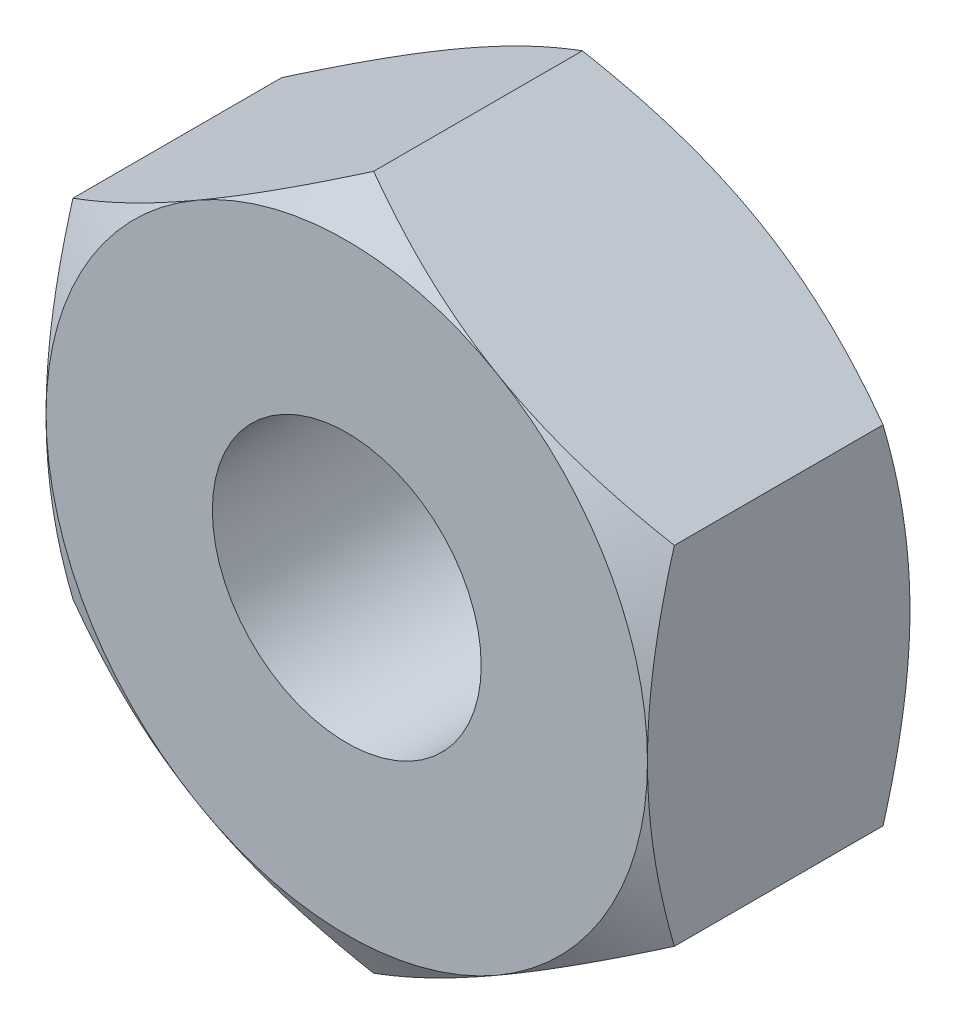
ISO-10303-21;
HEADER;
FILE_DESCRIPTION(('STEP AP214'),'2;1');
FILE_NAME('part.step','',(''),(''),'','','');
FILE_SCHEMA(('AUTOMOTIVE_DESIGN { 1 0 10303 214 1 1 1 1 }'));
ENDSEC;
DATA;
#1=APPLICATION_CONTEXT('core data for automotive mechanical design processes');
#2=APPLICATION_PROTOCOL_DEFINITION('international standard','automotive_design',2000,#1);
#3=PRODUCT_CONTEXT('',#1,'mechanical');
#4=PRODUCT('Part','Part','',(#3));
#5=PRODUCT_RELATED_PRODUCT_CATEGORY('part','',(#4));
#6=PRODUCT_DEFINITION_FORMATION('','',#4);
#7=PRODUCT_DEFINITION_CONTEXT('part definition',#1,'design');
#8=PRODUCT_DEFINITION('design','',#6,#7);
#9=PRODUCT_DEFINITION_SHAPE('','',#8);
#10=(LENGTH_UNIT() NAMED_UNIT(*) SI_UNIT(.MILLI.,.METRE.));
#11=(NAMED_UNIT(*) PLANE_ANGLE_UNIT() SI_UNIT($,.RADIAN.));
#12=(NAMED_UNIT(*) SI_UNIT($,.STERADIAN.) SOLID_ANGLE_UNIT());
#13=UNCERTAINTY_MEASURE_WITH_UNIT(LENGTH_MEASURE(1.E-05),#10,'distance_accuracy_value','');
#14=(GEOMETRIC_REPRESENTATION_CONTEXT(3) GLOBAL_UNCERTAINTY_ASSIGNED_CONTEXT((#13)) GLOBAL_UNIT_ASSIGNED_CONTEXT((#10,
#11,#12)) REPRESENTATION_CONTEXT('',''));
#15=CARTESIAN_POINT('',(0.,0.,0.));
#16=DIRECTION('',(0.,0.,1.));
#17=DIRECTION('',(1.,0.,0.));
#18=AXIS2_PLACEMENT_3D('',#15,#16,#17);
#19=CARTESIAN_POINT('',(2.75000000000003,1.58771324027148,2.4));
#20=DIRECTION('',(-0.499999999999988,-0.866025403784445,0.));
#21=DIRECTION('',(0.866025403784445,-0.499999999999988,0.));
#22=AXIS2_PLACEMENT_3D('',#19,#20,#21);
#23=PLANE('',#22);
#24=CARTESIAN_POINT('',(2.75020000000003,1.58759777021764,2.15431323663522));
#25=CARTESIAN_POINT('',(2.62935077934012,1.65737010029699,2.19461233775072));
#26=CARTESIAN_POINT('',(2.50745839737739,1.72774469983534,2.23126309740233));
#27=CARTESIAN_POINT('',(2.26156287327213,1.86971254687003,2.29523781703019));
#28=CARTESIAN_POINT('',(2.13755536142617,1.94130831721583,2.32253914432549));
#29=CARTESIAN_POINT('',(1.89107720202407,2.08361254889599,2.36503825470588));
#30=CARTESIAN_POINT('',(1.7686444814126,2.15429911309864,2.38051888137754));
#31=CARTESIAN_POINT('',(1.5232028576311,2.29600490065923,2.39900060263006));
#32=CARTESIAN_POINT('',(1.4001948467671,2.36702360884403,2.4020170005374));
#33=CARTESIAN_POINT('',(1.17034121338921,2.49972966594897,2.39574685457146));
#34=CARTESIAN_POINT('',(1.06346120874598,2.56143686540072,2.3879998457233));
#35=CARTESIAN_POINT('',(0.850397532665255,2.68444923614046,2.36344481893565));
#36=CARTESIAN_POINT('',(0.744214598351115,2.74575398185007,2.34662841034944));
#37=CARTESIAN_POINT('',(0.530711510606819,2.86902004703205,2.30458807765405));
#38=CARTESIAN_POINT('',(0.423418383857148,2.93096576264317,2.27918591931278));
#39=CARTESIAN_POINT('',(0.21043252071595,3.05393320806132,2.22153277416003));
#40=CARTESIAN_POINT('',(0.104737054973348,3.11495651365993,2.18929533670103));
#41=CARTESIAN_POINT('',(-0.000200000000000037,3.17554195059676,2.15431323663525));
#42=B_SPLINE_CURVE_WITH_KNOTS('',3,(#24,#25,#26,#27,#28,#29,#30,#31,#32,#33,#34,#35,#36,#37,#38,
#39,#40,#41),.UNSPECIFIED.,.F.,.F.,(4,2,2,2,2,2,2,2,4),(0.,0.435912828725893,0.87287355711634,
1.29901931904673,1.72464171213575,2.09526089052939,2.46622354066376,2.84541551798558,
3.22386274754525),.UNSPECIFIED.);
#43=CARTESIAN_POINT('',(2.75000000000003,1.58771324027148,2.15437990693812));
#44=VERTEX_POINT('',#43);
#45=CARTESIAN_POINT('',(1.37499999999997,2.38156986040723,2.4));
#46=VERTEX_POINT('',#45);
#47=EDGE_CURVE('E63',#44,#46,#42,.T.);
#48=ORIENTED_EDGE('',*,*,#47,.F.);
#49=DIRECTION('',(0.,0.,-1.));
#50=VECTOR('',#49,1.);
#51=CARTESIAN_POINT('',(2.75000000000003,1.58771324027148,2.4));
#52=LINE('',#51,#50);
#53=CARTESIAN_POINT('',(2.75000000000003,1.58771324027148,0.245620093061878));
#54=VERTEX_POINT('',#53);
#55=EDGE_CURVE('E302',#44,#54,#52,.T.);
#56=ORIENTED_EDGE('',*,*,#55,.T.);
#57=CARTESIAN_POINT('',(-0.000199999999999888,3.17554195059676,0.245686763364745));
#58=CARTESIAN_POINT('',(0.120649220659907,3.10576962051741,0.205387662249249));
#59=CARTESIAN_POINT('',(0.242541602622635,3.03539502097906,0.168736902597649));
#60=CARTESIAN_POINT('',(0.488437126727894,2.89342717394437,0.104762182969791));
#61=CARTESIAN_POINT('',(0.612444638573857,2.82183140359857,0.077460855674489));
#62=CARTESIAN_POINT('',(0.858922797975946,2.67952717191842,0.0349617452941111));
#63=CARTESIAN_POINT('',(0.98135551858742,2.60884060771577,0.0194811186224533));
#64=CARTESIAN_POINT('',(1.22679714236892,2.46713482015518,0.000999397369938449));
#65=CARTESIAN_POINT('',(1.34980515323291,2.39611611197038,-0.0020170005374011));
#66=CARTESIAN_POINT('',(1.5796587866108,2.26341005486545,0.00425314542854814));
#67=CARTESIAN_POINT('',(1.68653879125403,2.20170285541369,0.0120001542767051));
#68=CARTESIAN_POINT('',(1.89960246733476,2.07869048467395,0.03655518106436));
#69=CARTESIAN_POINT('',(2.0057854016489,2.01738573896434,0.0533715896505767));
#70=CARTESIAN_POINT('',(2.2192884893932,1.89411967378236,0.0954119223459653));
#71=CARTESIAN_POINT('',(2.32658161614288,1.83217395817124,0.120814080687241));
#72=CARTESIAN_POINT('',(2.53956747928408,1.70920651275308,0.178467225839995));
#73=CARTESIAN_POINT('',(2.64526294502668,1.64818320715447,0.210704663298997));
#74=CARTESIAN_POINT('',(2.75020000000003,1.58759777021764,0.245686763364776));
#75=B_SPLINE_CURVE_WITH_KNOTS('',3,(#57,#58,#59,#60,#61,#62,#63,#64,#65,#66,#67,#68,#69,#70,#71,
#72,#73,#74),.UNSPECIFIED.,.F.,.F.,(4,2,2,2,2,2,2,2,4),(0.,0.435912828725885,0.872873557116326,
1.29901931904671,1.72464171213572,2.09526089052937,2.46622354066374,2.84541551798558,
3.22386274754525),.UNSPECIFIED.);
#76=CARTESIAN_POINT('',(1.37499999999997,2.38156986040723,0.));
#77=VERTEX_POINT('',#76);
#78=EDGE_CURVE('E238',#77,#54,#75,.T.);
#79=ORIENTED_EDGE('',*,*,#78,.F.);
#80=CARTESIAN_POINT('',(0.,3.17542648054292,0.245620093061847));
#81=VERTEX_POINT('',#80);
#82=EDGE_CURVE('E256',#81,#77,#75,.T.);
#83=ORIENTED_EDGE('',*,*,#82,.F.);
#84=DIRECTION('',(0.,0.,-1.));
#85=VECTOR('',#84,1.);
#86=CARTESIAN_POINT('',(0.,3.17542648054292,2.4));
#87=LINE('',#86,#85);
#88=CARTESIAN_POINT('',(0.,3.17542648054292,2.15437990693815));
#89=VERTEX_POINT('',#88);
#90=EDGE_CURVE('E269',#89,#81,#87,.T.);
#91=ORIENTED_EDGE('',*,*,#90,.F.);
#92=EDGE_CURVE('E284',#46,#89,#42,.T.);
#93=ORIENTED_EDGE('',*,*,#92,.F.);
#94=EDGE_LOOP('',(#48,#56,#79,#83,#91,#93));
#95=FACE_BOUND('',#94,.T.);
#96=ADVANCED_FACE('F40',(#95),#23,.F.);
#97=CARTESIAN_POINT('',(0.,3.17542648054292,2.4));
#98=DIRECTION('',(0.499999999999993,-0.866025403784443,0.));
#99=DIRECTION('',(0.866025403784443,0.499999999999993,0.));
#100=AXIS2_PLACEMENT_3D('',#97,#98,#99);
#101=PLANE('',#100);
#102=CARTESIAN_POINT('',(0.000200000000000068,3.17554195059676,2.15431323663525));
#103=CARTESIAN_POINT('',(-0.120649220659906,3.10576962051741,2.19461233775075));
#104=CARTESIAN_POINT('',(-0.242541602622633,3.03539502097906,2.23126309740235));
#105=CARTESIAN_POINT('',(-0.488437126727892,2.89342717394437,2.29523781703021));
#106=CARTESIAN_POINT('',(-0.612444638573855,2.82183140359857,2.32253914432551));
#107=CARTESIAN_POINT('',(-0.858922797975943,2.67952717191841,2.36503825470589));
#108=CARTESIAN_POINT('',(-0.981355518587416,2.60884060771576,2.38051888137755));
#109=CARTESIAN_POINT('',(-1.22679714236891,2.46713482015518,2.39900060263007));
#110=CARTESIAN_POINT('',(-1.34980515323291,2.39611611197037,2.40201700053741));
#111=CARTESIAN_POINT('',(-1.57965878661079,2.26341005486544,2.39574685457146));
#112=CARTESIAN_POINT('',(-1.68653879125402,2.20170285541368,2.3879998457233));
#113=CARTESIAN_POINT('',(-1.89960246733475,2.07869048467395,2.36344481893565));
#114=CARTESIAN_POINT('',(-2.00578540164889,2.01738573896434,2.34662841034943));
#115=CARTESIAN_POINT('',(-2.21928848939318,1.89411967378235,2.30458807765405));
#116=CARTESIAN_POINT('',(-2.32658161614285,1.83217395817123,2.27918591931277));
#117=CARTESIAN_POINT('',(-2.53956747928405,1.70920651275308,2.22153277416002));
#118=CARTESIAN_POINT('',(-2.64526294502665,1.64818320715447,2.18929533670102));
#119=CARTESIAN_POINT('',(-2.7502,1.58759777021764,2.15431323663524));
#120=B_SPLINE_CURVE_WITH_KNOTS('',3,(#102,#103,#104,#105,#106,#107,#108,#109,#110,#111,#112,
#113,#114,#115,#116,#117,#118,#119),.UNSPECIFIED.,.F.,.F.,(4,2,2,2,2,2,2,2,4),(0.,
0.435912828725885,0.872873557116326,1.29901931904671,1.72464171213572,2.09526089052936,
2.46622354066373,2.84541551798555,3.22386274754522),.UNSPECIFIED.);
#121=CARTESIAN_POINT('',(-1.37499999999998,2.38156986040722,2.4));
#122=VERTEX_POINT('',#121);
#123=EDGE_CURVE('E56',#89,#122,#120,.T.);
#124=ORIENTED_EDGE('',*,*,#123,.F.);
#125=ORIENTED_EDGE('',*,*,#90,.T.);
#126=CARTESIAN_POINT('',(-2.7502,1.58759777021764,0.245686763364759));
#127=CARTESIAN_POINT('',(-2.62935077934009,1.657370100297,0.205387662249261));
#128=CARTESIAN_POINT('',(-2.50745839737736,1.72774469983534,0.16873690259766));
#129=CARTESIAN_POINT('',(-2.2615628732721,1.86971254687003,0.104762182969798));
#130=CARTESIAN_POINT('',(-2.13755536142614,1.94130831721583,0.0774608556744943));
#131=CARTESIAN_POINT('',(-1.89107720202405,2.08361254889599,0.0349617452941131));
#132=CARTESIAN_POINT('',(-1.76864448141257,2.15429911309864,0.0194811186224537));
#133=CARTESIAN_POINT('',(-1.52320285763107,2.29600490065923,0.00099939736993548));
#134=CARTESIAN_POINT('',(-1.40019484676708,2.36702360884404,-0.00201700053740572));
#135=CARTESIAN_POINT('',(-1.1703412133892,2.49972966594897,0.00425314542854047));
#136=CARTESIAN_POINT('',(-1.06346120874597,2.56143686540072,0.0120001542766956));
#137=CARTESIAN_POINT('',(-0.850397532665243,2.68444923614046,0.036555181064347));
#138=CARTESIAN_POINT('',(-0.744214598351104,2.74575398185007,0.053371589650562));
#139=CARTESIAN_POINT('',(-0.530711510606811,2.86902004703205,0.0954119223459464));
#140=CARTESIAN_POINT('',(-0.423418383857141,2.93096576264317,0.12081408068722));
#141=CARTESIAN_POINT('',(-0.210432520715947,3.05393320806132,0.178467225839969));
#142=CARTESIAN_POINT('',(-0.104737054973347,3.11495651365993,0.210704663298968));
#143=CARTESIAN_POINT('',(0.000199999999999906,3.17554195059676,0.245686763364745));
#144=B_SPLINE_CURVE_WITH_KNOTS('',3,(#126,#127,#128,#129,#130,#131,#132,#133,#134,#135,#136,
#137,#138,#139,#140,#141,#142,#143),.UNSPECIFIED.,.F.,.F.,(4,2,2,2,2,2,2,2,4),(0.,
0.435912828725888,0.872873557116332,1.29901931904672,1.72464171213574,2.09526089052937,
2.46622354066373,2.84541551798556,3.22386274754522),.UNSPECIFIED.);
#145=CARTESIAN_POINT('',(-1.37499999999998,2.38156986040721,0.));
#146=VERTEX_POINT('',#145);
#147=EDGE_CURVE('E200',#146,#81,#144,.T.);
#148=ORIENTED_EDGE('',*,*,#147,.F.);
#149=CARTESIAN_POINT('',(-2.75,1.58771324027148,0.24562009306186));
#150=VERTEX_POINT('',#149);
#151=EDGE_CURVE('E255',#150,#146,#144,.T.);
#152=ORIENTED_EDGE('',*,*,#151,.F.);
#153=DIRECTION('',(0.,0.,-1.));
#154=VECTOR('',#153,1.);
#155=CARTESIAN_POINT('',(-2.75,1.58771324027148,2.4));
#156=LINE('',#155,#154);
#157=CARTESIAN_POINT('',(-2.75,1.58771324027148,2.15437990693814));
#158=VERTEX_POINT('',#157);
#159=EDGE_CURVE('E293',#158,#150,#156,.T.);
#160=ORIENTED_EDGE('',*,*,#159,.F.);
#161=EDGE_CURVE('E135',#122,#158,#120,.T.);
#162=ORIENTED_EDGE('',*,*,#161,.F.);
#163=EDGE_LOOP('',(#124,#125,#148,#152,#160,#162));
#164=FACE_BOUND('',#163,.T.);
#165=ADVANCED_FACE('F184',(#164),#101,.F.);
#166=CARTESIAN_POINT('',(-2.75,1.58771324027148,2.4));
#167=DIRECTION('',(1.,0.,0.));
#168=DIRECTION('',(0.,1.,0.));
#169=AXIS2_PLACEMENT_3D('',#166,#167,#168);
#170=PLANE('',#169);
#171=CARTESIAN_POINT('',(-2.74999999999997,-4.3374364907856,1.02259068453575));
#172=CARTESIAN_POINT('',(-2.74999999999997,-4.21668297632684,1.08145539212977));
#173=CARTESIAN_POINT('',(-2.74999999999997,-4.09565991534466,1.13977626087958));
#174=CARTESIAN_POINT('',(-2.74999999999997,-3.85293159632068,1.25502579241243));
#175=CARTESIAN_POINT('',(-2.74999999999997,-3.73122624052147,1.31195424908558));
#176=CARTESIAN_POINT('',(-2.74999999999997,-3.48639747629137,1.42438541157054));
#177=CARTESIAN_POINT('',(-2.74999999999997,-3.36326999363584,1.4798792748257));
#178=CARTESIAN_POINT('',(-2.74999999999997,-3.11606063677581,1.5886905941961));
#179=CARTESIAN_POINT('',(-2.74999999999998,-2.99197880595775,1.64200814856341));
#180=CARTESIAN_POINT('',(-2.74999999999998,-2.73841922097274,1.7476631210882));
#181=CARTESIAN_POINT('',(-2.74999999999998,-2.60890159401846,1.79990535269861));
#182=CARTESIAN_POINT('',(-2.74999999999998,-2.34837817612552,1.90060893699885));
#183=CARTESIAN_POINT('',(-2.74999999999998,-2.21737222407672,1.94906987581165));
#184=CARTESIAN_POINT('',(-2.74999999999998,-1.95388620344956,2.04099184384335));
#185=CARTESIAN_POINT('',(-2.74999999999998,-1.82140948770462,2.08446239048313));
#186=CARTESIAN_POINT('',(-2.74999999999998,-1.5545570647704,2.16505703458995));
#187=CARTESIAN_POINT('',(-2.74999999999998,-1.4201819464315,2.20218305516994));
#188=CARTESIAN_POINT('',(-2.74999999999998,-1.15020155114681,2.26815804294274));
#189=CARTESIAN_POINT('',(-2.74999999999998,-1.01460786226709,2.2970535787294));
#190=CARTESIAN_POINT('',(-2.74999999999998,-0.741660873132741,2.34498224284926));
#191=CARTESIAN_POINT('',(-2.74999999999999,-0.604307767672248,2.36401645347349));
#192=CARTESIAN_POINT('',(-2.74999999999999,-0.330350919307992,2.39045867878119));
#193=CARTESIAN_POINT('',(-2.74999999999999,-0.193762526407011,2.39802179576713));
#194=CARTESIAN_POINT('',(-2.74999999999999,0.0795711345654302,2.40129387255956));
#195=CARTESIAN_POINT('',(-2.74999999999999,0.216316404731971,2.39700267216643));
#196=CARTESIAN_POINT('',(-2.74999999999999,0.446339203020201,2.38012375921468));
#197=CARTESIAN_POINT('',(-2.74999999999999,0.53985279127044,2.37054609001925));
#198=CARTESIAN_POINT('',(-2.74999999999999,0.726238383551516,2.34640493595207));
#199=CARTESIAN_POINT('',(-2.74999999999999,0.819110306808893,2.33184083464208));
#200=CARTESIAN_POINT('',(-2.74999999999999,1.0966132972771,2.28143000252485));
#201=CARTESIAN_POINT('',(-2.74999999999999,1.28004120201699,2.23887229474506));
#202=CARTESIAN_POINT('',(-2.75,1.55447412390721,2.16451574499409));
#203=CARTESIAN_POINT('',(-2.75,1.64688532091927,2.13760639076067));
#204=CARTESIAN_POINT('',(-2.75,1.8308113254176,2.0808543830873));
#205=CARTESIAN_POINT('',(-2.75,1.92232612591339,2.05101170679209));
#206=CARTESIAN_POINT('',(-2.75,2.10448679035931,1.98888337289225));
#207=CARTESIAN_POINT('',(-2.75,2.1951328867834,1.95659839067799));
#208=CARTESIAN_POINT('',(-2.75,2.37566387632138,1.88997905538601));
#209=CARTESIAN_POINT('',(-2.75,2.46554878741144,1.85564475086014));
#210=CARTESIAN_POINT('',(-2.75,2.70921665609181,1.75989148700234));
#211=CARTESIAN_POINT('',(-2.75,2.86233959917345,1.69679445551503));
#212=CARTESIAN_POINT('',(-2.75,3.16698958357126,1.56684501802565));
#213=CARTESIAN_POINT('',(-2.75,3.31851643910333,1.49999218046167));
#214=CARTESIAN_POINT('',(-2.75,3.62033953387397,1.36343135891056));
#215=CARTESIAN_POINT('',(-2.75000000000001,3.77063531016818,1.29372235513852));
#216=CARTESIAN_POINT('',(-2.75000000000001,4.07019939608841,1.15212641722021));
#217=CARTESIAN_POINT('',(-2.75000000000001,4.21946767323327,1.08023941460786));
#218=CARTESIAN_POINT('',(-2.75000000000001,4.66651878903756,0.861828955903561));
#219=CARTESIAN_POINT('',(-2.75000000000001,4.96306534802303,0.712778470152965));
#220=CARTESIAN_POINT('',(-2.75000000000001,5.55391082511625,0.410475903586831));
#221=CARTESIAN_POINT('',(-2.75000000000001,5.84821021601236,0.257224739551757));
#222=CARTESIAN_POINT('',(-2.75000000000002,6.40383089196402,-0.0355572881061463));
#223=CARTESIAN_POINT('',(-2.75000000000002,6.66530541427461,-0.17479784648198));
#224=CARTESIAN_POINT('',(-2.75000000000002,7.18737973078273,-0.45494632264209));
#225=CARTESIAN_POINT('',(-2.75000000000002,7.44797946799152,-0.595854346449224));
#226=CARTESIAN_POINT('',(-2.75000000000002,7.96761576117524,-0.878420691377239));
#227=CARTESIAN_POINT('',(-2.75000000000002,8.22665461443523,-1.0200747927889));
#228=CARTESIAN_POINT('',(-2.75000000000003,8.74418626025134,-1.30432785087229));
#229=CARTESIAN_POINT('',(-2.75000000000003,9.00267909538574,-1.44692672999129));
#230=CARTESIAN_POINT('',(-2.75000000000003,9.26098069936511,-1.58986877807102));
#231=B_SPLINE_CURVE_WITH_KNOTS('',3,(#171,#172,#173,#174,#175,#176,#177,#178,#179,#180,#181,
#182,#183,#184,#185,#186,#187,#188,#189,#190,#191,#192,#193,#194,#195,#196,#197,#198,#199,#200,
#201,#202,#203,#204,#205,#206,#207,#208,#209,#210,#211,#212,#213,#214,#215,#216,#217,#218,#219,
#220,#221,#222,#223,#224,#225,#226,#227,#228,#229,#230),.UNSPECIFIED.,.F.,.F.,(4,2,2,2,2,2,2,2,
2,2,2,2,2,2,2,2,2,2,2,2,2,2,2,2,2,2,2,2,2,4),(0.,0.40301598337421,0.806091265961217,
1.21124039369566,1.61637121020937,2.03529641501443,2.45426740866021,2.87242559998334,
3.29045681613043,3.70607354052351,4.12164464086645,4.53154502050441,4.94145093957608,
5.22332396016594,5.50523183936426,6.06931844566414,6.35804005776696,6.6467639196512,
6.93540822825629,7.22404570111203,7.72081118714503,8.2176338713641,8.7146355172951,
9.21165280287365,10.2072810066298,11.2026936221529,12.0913988586536,12.9801609088155,
13.8658805024974,14.7515282704766),.UNSPECIFIED.);
#232=CARTESIAN_POINT('',(-2.75,0.,2.4));
#233=VERTEX_POINT('',#232);
#234=EDGE_CURVE('E129',#158,#233,#231,.F.);
#235=ORIENTED_EDGE('',*,*,#234,.F.);
#236=ORIENTED_EDGE('',*,*,#159,.T.);
#237=CARTESIAN_POINT('',(-2.74999999999997,-4.3374364907856,1.37740931546425));
#238=CARTESIAN_POINT('',(-2.74999999999997,-4.21668297632684,1.31854460787023));
#239=CARTESIAN_POINT('',(-2.74999999999997,-4.09565991534466,1.26022373912042));
#240=CARTESIAN_POINT('',(-2.74999999999997,-3.85293159632068,1.14497420758757));
#241=CARTESIAN_POINT('',(-2.74999999999997,-3.73122624052147,1.08804575091442));
#242=CARTESIAN_POINT('',(-2.74999999999997,-3.48639747629138,0.975614588429458));
#243=CARTESIAN_POINT('',(-2.74999999999997,-3.36326999363584,0.920120725174295));
#244=CARTESIAN_POINT('',(-2.74999999999997,-3.11606063677581,0.811309405803901));
#245=CARTESIAN_POINT('',(-2.74999999999998,-2.99197880595775,0.757991851436588));
#246=CARTESIAN_POINT('',(-2.74999999999998,-2.73841922097274,0.652336878911797));
#247=CARTESIAN_POINT('',(-2.74999999999998,-2.60890159401846,0.600094647301395));
#248=CARTESIAN_POINT('',(-2.74999999999998,-2.34837817612552,0.499391063001153));
#249=CARTESIAN_POINT('',(-2.74999999999998,-2.21737222407672,0.450930124188351));
#250=CARTESIAN_POINT('',(-2.74999999999998,-1.95388620344956,0.359008156156654));
#251=CARTESIAN_POINT('',(-2.74999999999998,-1.82140948770462,0.315537609516873));
#252=CARTESIAN_POINT('',(-2.74999999999998,-1.5545570647704,0.23494296541005));
#253=CARTESIAN_POINT('',(-2.74999999999998,-1.4201819464315,0.197816944830062));
#254=CARTESIAN_POINT('',(-2.74999999999998,-1.15020155114681,0.131841957057262));
#255=CARTESIAN_POINT('',(-2.74999999999998,-1.01460786226709,0.102946421270605));
#256=CARTESIAN_POINT('',(-2.74999999999998,-0.74166087313274,0.0550177571507441));
#257=CARTESIAN_POINT('',(-2.74999999999999,-0.604307767672247,0.0359835465265098));
#258=CARTESIAN_POINT('',(-2.74999999999999,-0.330350919307992,0.00954132121880964));
#259=CARTESIAN_POINT('',(-2.74999999999999,-0.193762526407011,0.00197820423286484));
#260=CARTESIAN_POINT('',(-2.74999999999999,0.0795711345654302,-0.00129387255956411));
#261=CARTESIAN_POINT('',(-2.74999999999999,0.216316404731971,0.00299732783356914));
#262=CARTESIAN_POINT('',(-2.74999999999999,0.446339203020201,0.0198762407853179));
#263=CARTESIAN_POINT('',(-2.74999999999999,0.53985279127044,0.0294539099807471));
#264=CARTESIAN_POINT('',(-2.74999999999999,0.726238383551516,0.0535950640479271));
#265=CARTESIAN_POINT('',(-2.74999999999999,0.819110306808892,0.0681591653579162));
#266=CARTESIAN_POINT('',(-2.74999999999999,1.0966132972771,0.11856999747515));
#267=CARTESIAN_POINT('',(-2.74999999999999,1.28004120201699,0.161127705254941));
#268=CARTESIAN_POINT('',(-2.75,1.55447412390721,0.235484255005912));
#269=CARTESIAN_POINT('',(-2.75,1.64688532091927,0.262393609239333));
#270=CARTESIAN_POINT('',(-2.75,1.8308113254176,0.319145616912697));
#271=CARTESIAN_POINT('',(-2.75,1.92232612591339,0.34898829320791));
#272=CARTESIAN_POINT('',(-2.75,2.10448679035931,0.411116627107751));
#273=CARTESIAN_POINT('',(-2.75,2.1951328867834,0.443401609322013));
#274=CARTESIAN_POINT('',(-2.75,2.37566387632138,0.510020944613989));
#275=CARTESIAN_POINT('',(-2.75,2.46554878741144,0.544355249139862));
#276=CARTESIAN_POINT('',(-2.75,2.70921665609181,0.640108512997655));
#277=CARTESIAN_POINT('',(-2.75,2.86233959917345,0.703205544484967));
#278=CARTESIAN_POINT('',(-2.75,3.16698958357126,0.833154981974348));
#279=CARTESIAN_POINT('',(-2.75,3.31851643910333,0.900007819538325));
#280=CARTESIAN_POINT('',(-2.75,3.62033953387397,1.03656864108944));
#281=CARTESIAN_POINT('',(-2.75000000000001,3.77063531016818,1.10627764486148));
#282=CARTESIAN_POINT('',(-2.75000000000001,4.07019939608841,1.24787358277979));
#283=CARTESIAN_POINT('',(-2.75000000000001,4.21946767323327,1.31976058539214));
#284=CARTESIAN_POINT('',(-2.75000000000001,4.66651878903756,1.53817104409644));
#285=CARTESIAN_POINT('',(-2.75000000000001,4.96306534802303,1.68722152984704));
#286=CARTESIAN_POINT('',(-2.75000000000001,5.55391082511625,1.98952409641317));
#287=CARTESIAN_POINT('',(-2.75000000000001,5.84821021601237,2.14277526044824));
#288=CARTESIAN_POINT('',(-2.75000000000002,6.40383089196402,2.43555728810615));
#289=CARTESIAN_POINT('',(-2.75000000000002,6.66530541427461,2.57479784648198));
#290=CARTESIAN_POINT('',(-2.75000000000002,7.18737973078273,2.85494632264209));
#291=CARTESIAN_POINT('',(-2.75000000000002,7.44797946799153,2.99585434644922));
#292=CARTESIAN_POINT('',(-2.75000000000002,7.96761576117524,3.27842069137724));
#293=CARTESIAN_POINT('',(-2.75000000000002,8.22665461443523,3.4200747927889));
#294=CARTESIAN_POINT('',(-2.75000000000003,8.74418626025134,3.70432785087229));
#295=CARTESIAN_POINT('',(-2.75000000000003,9.00267909538574,3.84692672999129));
#296=CARTESIAN_POINT('',(-2.75000000000003,9.26098069936511,3.98986877807102));
#297=B_SPLINE_CURVE_WITH_KNOTS('',3,(#237,#238,#239,#240,#241,#242,#243,#244,#245,#246,#247,
#248,#249,#250,#251,#252,#253,#254,#255,#256,#257,#258,#259,#260,#261,#262,#263,#264,#265,#266,
#267,#268,#269,#270,#271,#272,#273,#274,#275,#276,#277,#278,#279,#280,#281,#282,#283,#284,#285,
#286,#287,#288,#289,#290,#291,#292,#293,#294,#295,#296),.UNSPECIFIED.,.F.,.F.,(4,2,2,2,2,2,2,2,
2,2,2,2,2,2,2,2,2,2,2,2,2,2,2,2,2,2,2,2,2,4),(0.,0.40301598337421,0.806091265961217,
1.21124039369566,1.61637121020936,2.03529641501443,2.45426740866021,2.87242559998334,
3.29045681613043,3.70607354052351,4.12164464086645,4.53154502050441,4.94145093957608,
5.22332396016594,5.50523183936426,6.06931844566414,6.35804005776696,6.6467639196512,
6.93540822825629,7.22404570111203,7.72081118714503,8.2176338713641,8.7146355172951,
9.21165280287365,10.2072810066298,11.2026936221529,12.0913988586536,12.9801609088155,
13.8658805024974,14.7515282704766),.UNSPECIFIED.);
#298=CARTESIAN_POINT('',(-2.74999999999999,0.,0.));
#299=VERTEX_POINT('',#298);
#300=EDGE_CURVE('E190',#299,#150,#297,.T.);
#301=ORIENTED_EDGE('',*,*,#300,.F.);
#302=CARTESIAN_POINT('',(-2.74999999999998,-1.5877132402715,0.24562009306186));
#303=VERTEX_POINT('',#302);
#304=EDGE_CURVE('E198',#303,#299,#297,.T.);
#305=ORIENTED_EDGE('',*,*,#304,.F.);
#306=DIRECTION('',(0.,0.,-1.));
#307=VECTOR('',#306,1.);
#308=CARTESIAN_POINT('',(-2.74999999999998,-1.5877132402715,2.4));
#309=LINE('',#308,#307);
#310=CARTESIAN_POINT('',(-2.74999999999998,-1.5877132402715,2.15437990693814));
#311=VERTEX_POINT('',#310);
#312=EDGE_CURVE('E157',#311,#303,#309,.T.);
#313=ORIENTED_EDGE('',*,*,#312,.F.);
#314=EDGE_CURVE('E139',#233,#311,#231,.F.);
#315=ORIENTED_EDGE('',*,*,#314,.F.);
#316=EDGE_LOOP('',(#235,#236,#301,#305,#313,#315));
#317=FACE_BOUND('',#316,.T.);
#318=ADVANCED_FACE('F155',(#317),#170,.F.);
#319=CARTESIAN_POINT('',(-2.74999999999998,-1.5877132402715,2.4));
#320=DIRECTION('',(0.499999999999996,0.866025403784441,0.));
#321=DIRECTION('',(-0.866025403784441,0.499999999999996,0.));
#322=AXIS2_PLACEMENT_3D('',#319,#320,#321);
#323=PLANE('',#322);
#324=CARTESIAN_POINT('',(-2.75019999999998,-1.58759777021766,2.15431323663524));
#325=CARTESIAN_POINT('',(-2.62935077934008,-1.65737010029702,2.19461233775074));
#326=CARTESIAN_POINT('',(-2.50745839737735,-1.72774469983536,2.23126309740234));
#327=CARTESIAN_POINT('',(-2.26156287327209,-1.86971254687006,2.2952378170302));
#328=CARTESIAN_POINT('',(-2.13755536142612,-1.94130831721586,2.3225391443255));
#329=CARTESIAN_POINT('',(-1.89107720202404,-2.08361254889602,2.36503825470588));
#330=CARTESIAN_POINT('',(-1.76864448141256,-2.15429911309867,2.38051888137754));
#331=CARTESIAN_POINT('',(-1.52320285763106,-2.29600490065925,2.39900060263006));
#332=CARTESIAN_POINT('',(-1.40019484676707,-2.36702360884406,2.4020170005374));
#333=CARTESIAN_POINT('',(-1.17034121338919,-2.49972966594899,2.39574685457145));
#334=CARTESIAN_POINT('',(-1.06346120874596,-2.56143686540075,2.38799984572329));
#335=CARTESIAN_POINT('',(-0.850397532665233,-2.68444923614048,2.36344481893564));
#336=CARTESIAN_POINT('',(-0.744214598351095,-2.7457539818501,2.34662841034942));
#337=CARTESIAN_POINT('',(-0.530711510606803,-2.86902004703208,2.30458807765404));
#338=CARTESIAN_POINT('',(-0.423418383857133,-2.93096576264319,2.27918591931277));
#339=CARTESIAN_POINT('',(-0.21043252071594,-3.05393320806135,2.22153277416002));
#340=CARTESIAN_POINT('',(-0.104737054973339,-3.11495651365996,2.18929533670102));
#341=CARTESIAN_POINT('',(0.000200000000006767,-3.17554195059679,2.15431323663524));
#342=B_SPLINE_CURVE_WITH_KNOTS('',3,(#324,#325,#326,#327,#328,#329,#330,#331,#332,#333,#334,
#335,#336,#337,#338,#339,#340,#341),.UNSPECIFIED.,.F.,.F.,(4,2,2,2,2,2,2,2,4),(0.,
0.435912828725888,0.872873557116332,1.29901931904671,1.72464171213574,2.09526089052937,
2.46622354066373,2.84541551798555,3.22386274754522),.UNSPECIFIED.);
#343=CARTESIAN_POINT('',(-1.37499999999999,-2.38156986040722,2.4));
#344=VERTEX_POINT('',#343);
#345=EDGE_CURVE('E146',#311,#344,#342,.T.);
#346=ORIENTED_EDGE('',*,*,#345,.F.);
#347=ORIENTED_EDGE('',*,*,#312,.T.);
#348=CARTESIAN_POINT('',(0.000200000000006939,-3.17554195059679,0.245686763364761));
#349=CARTESIAN_POINT('',(-0.1206492206599,-3.10576962051743,0.205387662249264));
#350=CARTESIAN_POINT('',(-0.242541602622628,-3.03539502097909,0.168736902597663));
#351=CARTESIAN_POINT('',(-0.488437126727889,-2.89342717394439,0.104762182969803));
#352=CARTESIAN_POINT('',(-0.612444638573852,-2.82183140359859,0.0774608556744998));
#353=CARTESIAN_POINT('',(-0.858922797975941,-2.67952717191843,0.0349617452941196));
#354=CARTESIAN_POINT('',(-0.981355518587416,-2.60884060771578,0.0194811186224607));
#355=CARTESIAN_POINT('',(-1.22679714236891,-2.4671348201552,0.000999397369943777));
#356=CARTESIAN_POINT('',(-1.34980515323291,-2.39611611197039,-0.00201700053739662));
#357=CARTESIAN_POINT('',(-1.57965878661079,-2.26341005486546,0.0042531454285508));
#358=CARTESIAN_POINT('',(-1.68653879125402,-2.2017028554137,0.0120001542767064));
#359=CARTESIAN_POINT('',(-1.89960246733474,-2.07869048467396,0.0365551810643583));
#360=CARTESIAN_POINT('',(-2.00578540164888,-2.01738573896435,0.0533715896505734));
#361=CARTESIAN_POINT('',(-2.21928848939317,-1.89411967378237,0.0954119223459583));
#362=CARTESIAN_POINT('',(-2.32658161614284,-1.83217395817125,0.120814080687232));
#363=CARTESIAN_POINT('',(-2.53956747928404,-1.7092065127531,0.178467225839981));
#364=CARTESIAN_POINT('',(-2.64526294502664,-1.64818320715449,0.210704663298981));
#365=CARTESIAN_POINT('',(-2.75019999999998,-1.58759777021766,0.245686763364757));
#366=B_SPLINE_CURVE_WITH_KNOTS('',3,(#348,#349,#350,#351,#352,#353,#354,#355,#356,#357,#358,
#359,#360,#361,#362,#363,#364,#365),.UNSPECIFIED.,.F.,.F.,(4,2,2,2,2,2,2,2,4),(0.,
0.435912828725889,0.872873557116334,1.29901931904672,1.72464171213574,2.09526089052937,
2.46622354066373,2.84541551798555,3.22386274754522),.UNSPECIFIED.);
#367=CARTESIAN_POINT('',(-1.37499999999999,-2.38156986040722,0.));
#368=VERTEX_POINT('',#367);
#369=EDGE_CURVE('E199',#368,#303,#366,.T.);
#370=ORIENTED_EDGE('',*,*,#369,.F.);
#371=CARTESIAN_POINT('',(0.,-3.17542648054295,0.245620093061863));
#372=VERTEX_POINT('',#371);
#373=EDGE_CURVE('E243',#372,#368,#366,.T.);
#374=ORIENTED_EDGE('',*,*,#373,.F.);
#375=DIRECTION('',(0.,0.,-1.));
#376=VECTOR('',#375,1.);
#377=CARTESIAN_POINT('',(0.,-3.17542648054295,2.4));
#378=LINE('',#377,#376);
#379=CARTESIAN_POINT('',(0.,-3.17542648054295,2.15437990693814));
#380=VERTEX_POINT('',#379);
#381=EDGE_CURVE('E298',#380,#372,#378,.T.);
#382=ORIENTED_EDGE('',*,*,#381,.F.);
#383=EDGE_CURVE('E158',#344,#380,#342,.T.);
#384=ORIENTED_EDGE('',*,*,#383,.F.);
#385=EDGE_LOOP('',(#346,#347,#370,#374,#382,#384));
#386=FACE_BOUND('',#385,.T.);
#387=ADVANCED_FACE('F183',(#386),#323,.F.);
#388=CARTESIAN_POINT('',(0.,-3.17542648054295,2.4));
#389=DIRECTION('',(-0.499999999999998,0.866025403784439,0.));
#390=DIRECTION('',(-0.86602540378444,-0.499999999999999,0.));
#391=AXIS2_PLACEMENT_3D('',#388,#389,#390);
#392=PLANE('',#391);
#393=CARTESIAN_POINT('',(-0.000199999999993136,-3.17554195059679,2.15431323663524));
#394=CARTESIAN_POINT('',(0.120649220659913,-3.10576962051743,2.19461233775073));
#395=CARTESIAN_POINT('',(0.242541602622641,-3.03539502097909,2.23126309740234));
#396=CARTESIAN_POINT('',(0.488437126727901,-2.89342717394439,2.2952378170302));
#397=CARTESIAN_POINT('',(0.612444638573865,-2.82183140359859,2.3225391443255));
#398=CARTESIAN_POINT('',(0.858922797975954,-2.67952717191843,2.36503825470588));
#399=CARTESIAN_POINT('',(0.981355518587428,-2.60884060771578,2.38051888137754));
#400=CARTESIAN_POINT('',(1.22679714236893,-2.46713482015519,2.39900060263005));
#401=CARTESIAN_POINT('',(1.34980515323292,-2.39611611197038,2.40201700053739));
#402=CARTESIAN_POINT('',(1.57965878661081,-2.26341005486545,2.39574685457145));
#403=CARTESIAN_POINT('',(1.68653879125404,-2.20170285541369,2.38799984572329));
#404=CARTESIAN_POINT('',(1.89960246733477,-2.07869048467395,2.36344481893564));
#405=CARTESIAN_POINT('',(2.00578540164891,-2.01738573896434,2.34662841034942));
#406=CARTESIAN_POINT('',(2.2192884893932,-1.89411967378235,2.30458807765404));
#407=CARTESIAN_POINT('',(2.32658161614287,-1.83217395817123,2.27918591931276));
#408=CARTESIAN_POINT('',(2.53956747928407,-1.70920651275308,2.22153277416001));
#409=CARTESIAN_POINT('',(2.64526294502667,-1.64818320715447,2.18929533670101));
#410=CARTESIAN_POINT('',(2.75020000000002,-1.58759777021764,2.15431323663523));
#411=B_SPLINE_CURVE_WITH_KNOTS('',3,(#393,#394,#395,#396,#397,#398,#399,#400,#401,#402,#403,
#404,#405,#406,#407,#408,#409,#410),.UNSPECIFIED.,.F.,.F.,(4,2,2,2,2,2,2,2,4),(0.,
0.435912828725889,0.872873557116334,1.29901931904672,1.72464171213574,2.09526089052938,
2.46622354066375,2.84541551798558,3.22386274754526),.UNSPECIFIED.);
#412=CARTESIAN_POINT('',(1.375,-2.38156986040721,2.4));
#413=VERTEX_POINT('',#412);
#414=EDGE_CURVE('E418',#380,#413,#411,.T.);
#415=ORIENTED_EDGE('',*,*,#414,.F.);
#416=ORIENTED_EDGE('',*,*,#381,.T.);
#417=CARTESIAN_POINT('',(2.75020000000002,-1.58759777021764,0.245686763364771));
#418=CARTESIAN_POINT('',(2.62935077934012,-1.65737010029699,0.205387662249273));
#419=CARTESIAN_POINT('',(2.50745839737739,-1.72774469983534,0.168736902597671));
#420=CARTESIAN_POINT('',(2.26156287327213,-1.86971254687003,0.104762182969809));
#421=CARTESIAN_POINT('',(2.13755536142616,-1.94130831721583,0.0774608556745048));
#422=CARTESIAN_POINT('',(1.89107720202407,-2.08361254889599,0.0349617452941235));
#423=CARTESIAN_POINT('',(1.7686444814126,-2.15429911309865,0.0194811186224639));
#424=CARTESIAN_POINT('',(1.5232028576311,-2.29600490065923,0.000999397369945761));
#425=CARTESIAN_POINT('',(1.4001948467671,-2.36702360884404,-0.00201700053739532));
#426=CARTESIAN_POINT('',(1.17034121338922,-2.49972966594898,0.00425314542855088));
#427=CARTESIAN_POINT('',(1.06346120874599,-2.56143686540073,0.0120001542767061));
#428=CARTESIAN_POINT('',(0.850397532665261,-2.68444923614047,0.0365551810643578));
#429=CARTESIAN_POINT('',(0.744214598351121,-2.74575398185008,0.0533715896505732));
#430=CARTESIAN_POINT('',(0.530711510606825,-2.86902004703207,0.0954119223459587));
#431=CARTESIAN_POINT('',(0.423418383857154,-2.93096576264319,0.120814080687233));
#432=CARTESIAN_POINT('',(0.210432520715957,-3.05393320806134,0.178467225839983));
#433=CARTESIAN_POINT('',(0.104737054973355,-3.11495651365996,0.210704663298984));
#434=CARTESIAN_POINT('',(-0.000199999999993459,-3.17554195059679,0.245686763364762));
#435=B_SPLINE_CURVE_WITH_KNOTS('',3,(#417,#418,#419,#420,#421,#422,#423,#424,#425,#426,#427,
#428,#429,#430,#431,#432,#433,#434),.UNSPECIFIED.,.F.,.F.,(4,2,2,2,2,2,2,2,4),(0.,
0.435912828725892,0.872873557116338,1.29901931904672,1.72464171213575,2.09526089052939,
2.46622354066376,2.84541551798559,3.22386274754526),.UNSPECIFIED.);
#436=CARTESIAN_POINT('',(1.375,-2.38156986040722,0.));
#437=VERTEX_POINT('',#436);
#438=EDGE_CURVE('E249',#437,#372,#435,.T.);
#439=ORIENTED_EDGE('',*,*,#438,.F.);
#440=CARTESIAN_POINT('',(2.75000000000002,-1.58771324027158,0.245620093061799));
#441=VERTEX_POINT('',#440);
#442=EDGE_CURVE('E231',#441,#437,#435,.T.);
#443=ORIENTED_EDGE('',*,*,#442,.F.);
#444=DIRECTION('',(0.,0.,-1.));
#445=VECTOR('',#444,1.);
#446=CARTESIAN_POINT('',(2.75000000000002,-1.58771324027147,2.4));
#447=LINE('',#446,#445);
#448=CARTESIAN_POINT('',(2.75000000000002,-1.58771324027158,2.1543799069382));
#449=VERTEX_POINT('',#448);
#450=EDGE_CURVE('E300',#449,#441,#447,.T.);
#451=ORIENTED_EDGE('',*,*,#450,.F.);
#452=EDGE_CURVE('E411',#413,#449,#411,.T.);
#453=ORIENTED_EDGE('',*,*,#452,.F.);
#454=EDGE_LOOP('',(#415,#416,#439,#443,#451,#453));
#455=FACE_BOUND('',#454,.T.);
#456=ADVANCED_FACE('F319',(#455),#392,.F.);
#457=CARTESIAN_POINT('',(2.75000000000002,-1.58771324027147,2.4));
#458=DIRECTION('',(-1.,0.,0.));
#459=DIRECTION('',(0.,-1.,0.));
#460=AXIS2_PLACEMENT_3D('',#457,#458,#459);
#461=PLANE('',#460);
#462=CARTESIAN_POINT('',(2.75000000000002,-4.33743649418527,1.02259068287804));
#463=CARTESIAN_POINT('',(2.75000000000002,-4.21668297961201,1.08145539054109));
#464=CARTESIAN_POINT('',(2.75000000000002,-4.09565991851527,1.1397762593599));
#465=CARTESIAN_POINT('',(2.75000000000002,-3.85293159926179,1.25502579103041));
#466=CARTESIAN_POINT('',(2.75000000000002,-3.73122624334766,1.31195424777222));
#467=CARTESIAN_POINT('',(2.75000000000002,-3.48639747888602,1.42438541039454));
#468=CARTESIAN_POINT('',(2.75000000000002,-3.36326999611384,1.47987927371838));
#469=CARTESIAN_POINT('',(2.75000000000002,-3.11606063901975,1.58869059322501));
#470=CARTESIAN_POINT('',(2.75000000000002,-2.99197880808426,1.64200814765988));
#471=CARTESIAN_POINT('',(2.75000000000002,-2.73841922285501,1.7476631203219));
#472=CARTESIAN_POINT('',(2.75000000000002,-2.60890159577384,1.79990535200182));
#473=CARTESIAN_POINT('',(2.75000000000002,-2.34837817762509,1.90060893643743));
#474=CARTESIAN_POINT('',(2.75000000000002,-2.21737222544737,1.94906987531608));
#475=CARTESIAN_POINT('',(2.75000000000002,-1.95388620456,2.04099184347327));
#476=CARTESIAN_POINT('',(2.75000000000002,-1.82140948868377,2.0844623901727));
#477=CARTESIAN_POINT('',(2.75000000000002,-1.55455706548344,2.16505703438924));
#478=CARTESIAN_POINT('',(2.75000000000002,-1.4201819470097,2.2021830550193));
#479=CARTESIAN_POINT('',(2.75000000000002,-1.15020155138705,2.26815804289327));
#480=CARTESIAN_POINT('',(2.75000000000002,-1.01460786230325,2.29705357872727));
#481=CARTESIAN_POINT('',(2.75000000000003,-0.741660872755743,2.34498224291119));
#482=CARTESIAN_POINT('',(2.75000000000003,-0.604307767086161,2.36401645355216));
#483=CARTESIAN_POINT('',(2.75000000000003,-0.330350918307129,2.39045867885598));
#484=CARTESIAN_POINT('',(2.75000000000003,-0.193762525200506,2.39802179582202));
#485=CARTESIAN_POINT('',(2.75000000000003,0.079571136180202,2.40129387253845));
#486=CARTESIAN_POINT('',(2.75000000000003,0.216316406549367,2.39700267208922));
#487=CARTESIAN_POINT('',(2.75000000000003,0.446339205090567,2.38012375902395));
#488=CARTESIAN_POINT('',(2.75000000000003,0.539852793393455,2.37054608978365));
#489=CARTESIAN_POINT('',(2.75000000000003,0.72623838577743,2.34640493562437));
#490=CARTESIAN_POINT('',(2.75000000000003,0.819110309085057,2.33184083426715));
#491=CARTESIAN_POINT('',(2.75000000000003,1.0966132997012,2.28143000200727));
#492=CARTESIAN_POINT('',(2.75000000000003,1.28004120453574,2.23887229413115));
#493=CARTESIAN_POINT('',(2.75000000000003,1.5544741265675,2.16451574423814));
#494=CARTESIAN_POINT('',(2.75000000000003,1.64688532362778,2.13760638995705));
#495=CARTESIAN_POINT('',(2.75000000000003,1.83081132822199,2.08085438218985));
#496=CARTESIAN_POINT('',(2.75000000000003,1.92232612876545,2.05101170584847));
#497=CARTESIAN_POINT('',(2.75000000000003,2.10448679330632,1.98888337185799));
#498=CARTESIAN_POINT('',(2.75000000000003,2.19513288977769,1.95659838959926));
#499=CARTESIAN_POINT('',(2.75000000000003,2.37566387941026,1.88997905421994));
#500=CARTESIAN_POINT('',(2.75000000000003,2.46554879054762,1.85564474965119));
#501=CARTESIAN_POINT('',(2.75000000000003,2.70921665925416,1.75989148571907));
#502=CARTESIAN_POINT('',(2.75000000000003,2.86233960231613,1.69679445420511));
#503=CARTESIAN_POINT('',(2.75000000000003,3.16698958667717,1.56684501667026));
#504=CARTESIAN_POINT('',(2.75000000000003,3.31851644219212,1.49999217908746));
#505=CARTESIAN_POINT('',(2.75000000000003,3.62033953693038,1.36343135750433));
#506=CARTESIAN_POINT('',(2.75000000000004,3.77063531320934,1.2937223537191));
#507=CARTESIAN_POINT('',(2.75000000000004,4.07019939910066,1.15212641577841));
#508=CARTESIAN_POINT('',(2.75000000000004,4.21946767623188,1.08023941315687));
#509=CARTESIAN_POINT('',(2.75000000000004,4.66651879199539,0.861828954430084));
#510=CARTESIAN_POINT('',(2.75000000000004,4.96306535095561,0.71277846867054));
#511=CARTESIAN_POINT('',(2.75000000000004,5.55391082800165,0.410475902092685));
#512=CARTESIAN_POINT('',(2.75000000000004,5.84821021887582,0.257224738054833));
#513=CARTESIAN_POINT('',(2.75000000000004,6.40383089480581,-0.0355572896142779));
#514=CARTESIAN_POINT('',(2.75000000000004,6.66530541711642,-0.174797847999083));
#515=CARTESIAN_POINT('',(2.75000000000004,7.1873797336254,-0.454946324175309));
#516=CARTESIAN_POINT('',(2.75000000000004,7.44797947083505,-0.595854347989587));
#517=CARTESIAN_POINT('',(2.75000000000004,7.96761576402423,-0.878420692932346));
#518=CARTESIAN_POINT('',(2.75000000000004,8.2266546172888,-1.02007479435162));
#519=CARTESIAN_POINT('',(2.75000000000005,8.74418626311464,-1.30432785244943));
#520=CARTESIAN_POINT('',(2.75000000000005,9.00267909825416,-1.44692673157524));
#521=CARTESIAN_POINT('',(2.75000000000005,9.26098070223879,-1.5898687796615));
#522=B_SPLINE_CURVE_WITH_KNOTS('',3,(#462,#463,#464,#465,#466,#467,#468,#469,#470,#471,#472,
#473,#474,#475,#476,#477,#478,#479,#480,#481,#482,#483,#484,#485,#486,#487,#488,#489,#490,#491,
#492,#493,#494,#495,#496,#497,#498,#499,#500,#501,#502,#503,#504,#505,#506,#507,#508,#509,#510,
#511,#512,#513,#514,#515,#516,#517,#518,#519,#520,#521),.UNSPECIFIED.,.F.,.F.,(4,2,2,2,2,2,2,2,
2,2,2,2,2,2,2,2,2,2,2,2,2,2,2,2,2,2,2,2,2,4),(0.,0.403015983773714,0.806091266760281,
1.21124039489841,1.61637121181576,2.03529641705186,2.45426741112882,2.87242560288175,
3.29045681945831,3.70607354447844,4.12164464544751,4.53154502569577,4.94145094537801,
5.22332396613868,5.50523184550783,6.0693184521501,6.35804006443189,6.64676392649507,
6.93540823527862,7.22404570831284,7.72081119432205,8.21763387851709,8.71463552442328,
9.21165280997696,10.2072810136777,11.2026936291463,12.0913988656597,12.9801609158341,
13.865880509539,14.7515282775415),.UNSPECIFIED.);
#523=CARTESIAN_POINT('',(2.75000000000003,0.,2.4));
#524=VERTEX_POINT('',#523);
#525=EDGE_CURVE('E413',#449,#524,#522,.T.);
#526=ORIENTED_EDGE('',*,*,#525,.F.);
#527=ORIENTED_EDGE('',*,*,#450,.T.);
#528=CARTESIAN_POINT('',(2.75000000000002,-4.33743649418527,1.37740931712196));
#529=CARTESIAN_POINT('',(2.75000000000002,-4.21668297961201,1.31854460945891));
#530=CARTESIAN_POINT('',(2.75000000000002,-4.09565991851527,1.2602237406401));
#531=CARTESIAN_POINT('',(2.75000000000002,-3.85293159926179,1.14497420896959));
#532=CARTESIAN_POINT('',(2.75000000000002,-3.73122624334766,1.08804575222778));
#533=CARTESIAN_POINT('',(2.75000000000002,-3.48639747888602,0.975614589605464));
#534=CARTESIAN_POINT('',(2.75000000000002,-3.36326999611384,0.920120726281621));
#535=CARTESIAN_POINT('',(2.75000000000002,-3.11606063901975,0.811309406774991));
#536=CARTESIAN_POINT('',(2.75000000000002,-2.99197880808426,0.757991852340124));
#537=CARTESIAN_POINT('',(2.75000000000002,-2.73841922285501,0.652336879678101));
#538=CARTESIAN_POINT('',(2.75000000000002,-2.60890159577384,0.600094647998181));
#539=CARTESIAN_POINT('',(2.75000000000002,-2.34837817762509,0.499391063562571));
#540=CARTESIAN_POINT('',(2.75000000000002,-2.21737222544737,0.450930124683919));
#541=CARTESIAN_POINT('',(2.75000000000002,-1.95388620456,0.359008156526732));
#542=CARTESIAN_POINT('',(2.75000000000002,-1.82140948868377,0.315537609827295));
#543=CARTESIAN_POINT('',(2.75000000000002,-1.55455706548344,0.234942965610757));
#544=CARTESIAN_POINT('',(2.75000000000002,-1.4201819470097,0.197816944980705));
#545=CARTESIAN_POINT('',(2.75000000000002,-1.15020155138705,0.13184195710673));
#546=CARTESIAN_POINT('',(2.75000000000002,-1.01460786230325,0.102946421272726));
#547=CARTESIAN_POINT('',(2.75000000000003,-0.741660872755743,0.0550177570888093));
#548=CARTESIAN_POINT('',(2.75000000000003,-0.604307767086162,0.0359835464478425));
#549=CARTESIAN_POINT('',(2.75000000000003,-0.33035091830713,0.00954132114401951));
#550=CARTESIAN_POINT('',(2.75000000000003,-0.193762525200506,0.00197820417798272));
#551=CARTESIAN_POINT('',(2.75000000000003,0.0795711361802021,-0.00129387253844921));
#552=CARTESIAN_POINT('',(2.75000000000003,0.216316406549367,0.00299732791078131));
#553=CARTESIAN_POINT('',(2.75000000000003,0.446339205090567,0.0198762409760531));
#554=CARTESIAN_POINT('',(2.75000000000003,0.539852793393455,0.0294539102163504));
#555=CARTESIAN_POINT('',(2.75000000000003,0.72623838577743,0.0535950643756287));
#556=CARTESIAN_POINT('',(2.75000000000003,0.819110309085056,0.0681591657328484));
#557=CARTESIAN_POINT('',(2.75000000000003,1.0966132997012,0.118569997992735));
#558=CARTESIAN_POINT('',(2.75000000000003,1.28004120453574,0.161127705868848));
#559=CARTESIAN_POINT('',(2.75000000000003,1.5544741265675,0.235484255761859));
#560=CARTESIAN_POINT('',(2.75000000000003,1.64688532362778,0.262393610042949));
#561=CARTESIAN_POINT('',(2.75000000000003,1.83081132822199,0.319145617810152));
#562=CARTESIAN_POINT('',(2.75000000000003,1.92232612876545,0.348988294151533));
#563=CARTESIAN_POINT('',(2.75000000000003,2.10448679330632,0.411116628142013));
#564=CARTESIAN_POINT('',(2.75000000000003,2.19513288977769,0.443401610400742));
#565=CARTESIAN_POINT('',(2.75000000000003,2.37566387941026,0.51002094578006));
#566=CARTESIAN_POINT('',(2.75000000000003,2.46554879054762,0.54435525034881));
#567=CARTESIAN_POINT('',(2.75000000000003,2.70921665925416,0.640108514280933));
#568=CARTESIAN_POINT('',(2.75000000000003,2.86233960231613,0.703205545794888));
#569=CARTESIAN_POINT('',(2.75000000000003,3.16698958667717,0.833154983329739));
#570=CARTESIAN_POINT('',(2.75000000000003,3.31851644219212,0.900007820912542));
#571=CARTESIAN_POINT('',(2.75000000000003,3.62033953693038,1.03656864249567));
#572=CARTESIAN_POINT('',(2.75000000000004,3.77063531320933,1.1062776462809));
#573=CARTESIAN_POINT('',(2.75000000000004,4.07019939910066,1.24787358422159));
#574=CARTESIAN_POINT('',(2.75000000000004,4.21946767623188,1.31976058684313));
#575=CARTESIAN_POINT('',(2.75000000000004,4.66651879199539,1.53817104556991));
#576=CARTESIAN_POINT('',(2.75000000000004,4.96306535095561,1.68722153132946));
#577=CARTESIAN_POINT('',(2.75000000000004,5.55391082800165,1.98952409790731));
#578=CARTESIAN_POINT('',(2.75000000000004,5.84821021887582,2.14277526194516));
#579=CARTESIAN_POINT('',(2.75000000000004,6.40383089480581,2.43555728961428));
#580=CARTESIAN_POINT('',(2.75000000000004,6.66530541711641,2.57479784799908));
#581=CARTESIAN_POINT('',(2.75000000000004,7.1873797336254,2.85494632417531));
#582=CARTESIAN_POINT('',(2.75000000000004,7.44797947083505,2.99585434798959));
#583=CARTESIAN_POINT('',(2.75000000000004,7.96761576402423,3.27842069293235));
#584=CARTESIAN_POINT('',(2.75000000000004,8.2266546172888,3.42007479435162));
#585=CARTESIAN_POINT('',(2.75000000000005,8.74418626311464,3.70432785244943));
#586=CARTESIAN_POINT('',(2.75000000000005,9.00267909825416,3.84692673157524));
#587=CARTESIAN_POINT('',(2.75000000000005,9.26098070223879,3.9898687796615));
#588=B_SPLINE_CURVE_WITH_KNOTS('',3,(#528,#529,#530,#531,#532,#533,#534,#535,#536,#537,#538,
#539,#540,#541,#542,#543,#544,#545,#546,#547,#548,#549,#550,#551,#552,#553,#554,#555,#556,#557,
#558,#559,#560,#561,#562,#563,#564,#565,#566,#567,#568,#569,#570,#571,#572,#573,#574,#575,#576,
#577,#578,#579,#580,#581,#582,#583,#584,#585,#586,#587),.UNSPECIFIED.,.F.,.F.,(4,2,2,2,2,2,2,2,
2,2,2,2,2,2,2,2,2,2,2,2,2,2,2,2,2,2,2,2,2,4),(0.,0.403015983773714,0.806091266760281,
1.21124039489841,1.61637121181576,2.03529641705186,2.45426741112882,2.87242560288175,
3.2904568194583,3.70607354447843,4.12164464544751,4.53154502569577,4.94145094537801,
5.22332396613868,5.50523184550783,6.06931845215011,6.35804006443189,6.64676392649507,
6.93540823527862,7.22404570831285,7.72081119432205,8.21763387851709,8.71463552442328,
9.21165280997696,10.2072810136777,11.2026936291463,12.0913988656597,12.9801609158341,
13.865880509539,14.7515282775415),.UNSPECIFIED.);
#589=CARTESIAN_POINT('',(2.75000000000003,0.,0.));
#590=VERTEX_POINT('',#589);
#591=EDGE_CURVE('E222',#590,#441,#588,.F.);
#592=ORIENTED_EDGE('',*,*,#591,.F.);
#593=EDGE_CURVE('E151',#54,#590,#588,.F.);
#594=ORIENTED_EDGE('',*,*,#593,.F.);
#595=ORIENTED_EDGE('',*,*,#55,.F.);
#596=EDGE_CURVE('E421',#524,#44,#522,.T.);
#597=ORIENTED_EDGE('',*,*,#596,.F.);
#598=EDGE_LOOP('',(#526,#527,#592,#594,#595,#597));
#599=FACE_BOUND('',#598,.T.);
#600=ADVANCED_FACE('F313',(#599),#461,.F.);
#601=CARTESIAN_POINT('',(2.75000000000003,1.58771324027148,2.4));
#602=DIRECTION('',(0.,0.,-1.));
#603=DIRECTION('',(-1.,0.,0.));
#604=AXIS2_PLACEMENT_3D('',#601,#602,#603);
#605=PLANE('',#604);
#606=CARTESIAN_POINT('',(0.,0.,2.4));
#607=DIRECTION('',(0.,0.,1.));
#608=DIRECTION('',(1.,0.,0.));
#609=AXIS2_PLACEMENT_3D('',#606,#607,#608);
#610=CIRCLE('',#609,1.229375);
#611=CARTESIAN_POINT('',(1.229375,0.,2.4));
#612=VERTEX_POINT('',#611);
#613=EDGE_CURVE('E206',#612,#612,#610,.T.);
#614=ORIENTED_EDGE('',*,*,#613,.F.);
#615=EDGE_LOOP('',(#614));
#616=FACE_BOUND('',#615,.T.);
#617=CARTESIAN_POINT('',(0.,0.,2.4));
#618=DIRECTION('',(0.,0.,-1.));
#619=DIRECTION('',(-1.,0.,0.));
#620=AXIS2_PLACEMENT_3D('',#617,#618,#619);
#621=CIRCLE('',#620,2.75);
#622=EDGE_CURVE('E12',#233,#122,#621,.T.);
#623=ORIENTED_EDGE('',*,*,#622,.F.);
#624=EDGE_CURVE('E44',#344,#233,#621,.T.);
#625=ORIENTED_EDGE('',*,*,#624,.F.);
#626=EDGE_CURVE('E150',#413,#344,#621,.T.);
#627=ORIENTED_EDGE('',*,*,#626,.F.);
#628=EDGE_CURVE('E415',#524,#413,#621,.T.);
#629=ORIENTED_EDGE('',*,*,#628,.F.);
#630=CARTESIAN_POINT('',(0.,0.,2.4));
#631=DIRECTION('',(0.,0.,1.));
#632=DIRECTION('',(1.,0.,0.));
#633=AXIS2_PLACEMENT_3D('',#630,#631,#632);
#634=CIRCLE('',#633,2.75);
#635=EDGE_CURVE('E514',#524,#46,#634,.T.);
#636=ORIENTED_EDGE('',*,*,#635,.T.);
#637=EDGE_CURVE('E49',#122,#46,#621,.T.);
#638=ORIENTED_EDGE('',*,*,#637,.F.);
#639=EDGE_LOOP('',(#623,#625,#627,#629,#636,#638));
#640=FACE_BOUND('',#639,.T.);
#641=ADVANCED_FACE('F152',(#616,#640),#605,.F.);
#642=CARTESIAN_POINT('',(2.75000000000003,1.58771324027148,0.));
#643=DIRECTION('',(0.,0.,-1.));
#644=DIRECTION('',(-1.,0.,0.));
#645=AXIS2_PLACEMENT_3D('',#642,#643,#644);
#646=PLANE('',#645);
#647=CARTESIAN_POINT('',(0.,0.,0.));
#648=DIRECTION('',(0.,0.,1.));
#649=DIRECTION('',(1.,0.,0.));
#650=AXIS2_PLACEMENT_3D('',#647,#648,#649);
#651=CIRCLE('',#650,1.229375);
#652=CARTESIAN_POINT('',(1.229375,0.,0.));
#653=VERTEX_POINT('',#652);
#654=EDGE_CURVE('E303',#653,#653,#651,.T.);
#655=ORIENTED_EDGE('',*,*,#654,.T.);
#656=EDGE_LOOP('',(#655));
#657=FACE_BOUND('',#656,.T.);
#658=CARTESIAN_POINT('',(0.,0.,0.));
#659=DIRECTION('',(0.,0.,-1.));
#660=DIRECTION('',(-1.,0.,0.));
#661=AXIS2_PLACEMENT_3D('',#658,#659,#660);
#662=CIRCLE('',#661,2.75);
#663=EDGE_CURVE('E279',#368,#299,#662,.T.);
#664=ORIENTED_EDGE('',*,*,#663,.T.);
#665=EDGE_CURVE('E265',#299,#146,#662,.T.);
#666=ORIENTED_EDGE('',*,*,#665,.T.);
#667=EDGE_CURVE('E277',#146,#77,#662,.T.);
#668=ORIENTED_EDGE('',*,*,#667,.T.);
#669=EDGE_CURVE('E281',#77,#590,#662,.T.);
#670=ORIENTED_EDGE('',*,*,#669,.T.);
#671=EDGE_CURVE('E283',#590,#437,#662,.T.);
#672=ORIENTED_EDGE('',*,*,#671,.T.);
#673=EDGE_CURVE('E282',#437,#368,#662,.T.);
#674=ORIENTED_EDGE('',*,*,#673,.T.);
#675=EDGE_LOOP('',(#664,#666,#668,#670,#672,#674));
#676=FACE_BOUND('',#675,.T.);
#677=ADVANCED_FACE('F275',(#657,#676),#646,.T.);
#678=CARTESIAN_POINT('',(0.,0.,2.4));
#679=DIRECTION('',(0.,0.,-1.));
#680=DIRECTION('',(-1.,0.,0.));
#681=AXIS2_PLACEMENT_3D('',#678,#679,#680);
#682=CYLINDRICAL_SURFACE('',#681,1.229375);
#683=ORIENTED_EDGE('',*,*,#613,.T.);
#684=EDGE_LOOP('',(#683));
#685=FACE_BOUND('',#684,.T.);
#686=ORIENTED_EDGE('',*,*,#654,.F.);
#687=EDGE_LOOP('',(#686));
#688=FACE_BOUND('',#687,.T.);
#689=ADVANCED_FACE('F216',(#685,#688),#682,.F.);
#690=CARTESIAN_POINT('',(0.,0.,0.));
#691=DIRECTION('',(0.,0.,1.));
#692=DIRECTION('',(-1.,0.,0.));
#693=AXIS2_PLACEMENT_3D('',#690,#691,#692);
#694=CONICAL_SURFACE('',#693,2.75,1.0471975511966);
#695=ORIENTED_EDGE('',*,*,#442,.T.);
#696=ORIENTED_EDGE('',*,*,#671,.F.);
#697=ORIENTED_EDGE('',*,*,#591,.T.);
#698=EDGE_LOOP('',(#695,#696,#697));
#699=FACE_BOUND('',#698,.T.);
#700=ADVANCED_FACE('F215',(#699),#694,.T.);
#701=ORIENTED_EDGE('',*,*,#78,.T.);
#702=ORIENTED_EDGE('',*,*,#593,.T.);
#703=ORIENTED_EDGE('',*,*,#669,.F.);
#704=EDGE_LOOP('',(#701,#702,#703));
#705=FACE_BOUND('',#704,.T.);
#706=ADVANCED_FACE('F431',(#705),#694,.T.);
#707=ORIENTED_EDGE('',*,*,#373,.T.);
#708=ORIENTED_EDGE('',*,*,#673,.F.);
#709=ORIENTED_EDGE('',*,*,#438,.T.);
#710=EDGE_LOOP('',(#707,#708,#709));
#711=FACE_BOUND('',#710,.T.);
#712=ADVANCED_FACE('F213',(#711),#694,.T.);
#713=ORIENTED_EDGE('',*,*,#304,.T.);
#714=ORIENTED_EDGE('',*,*,#663,.F.);
#715=ORIENTED_EDGE('',*,*,#369,.T.);
#716=EDGE_LOOP('',(#713,#714,#715));
#717=FACE_BOUND('',#716,.T.);
#718=ADVANCED_FACE('F208',(#717),#694,.T.);
#719=ORIENTED_EDGE('',*,*,#300,.T.);
#720=ORIENTED_EDGE('',*,*,#151,.T.);
#721=ORIENTED_EDGE('',*,*,#665,.F.);
#722=EDGE_LOOP('',(#719,#720,#721));
#723=FACE_BOUND('',#722,.T.);
#724=ADVANCED_FACE('F212',(#723),#694,.T.);
#725=ORIENTED_EDGE('',*,*,#147,.T.);
#726=ORIENTED_EDGE('',*,*,#82,.T.);
#727=ORIENTED_EDGE('',*,*,#667,.F.);
#728=EDGE_LOOP('',(#725,#726,#727));
#729=FACE_BOUND('',#728,.T.);
#730=ADVANCED_FACE('F365',(#729),#694,.T.);
#731=CARTESIAN_POINT('',(0.,0.,2.4));
#732=DIRECTION('',(0.,0.,-1.));
#733=DIRECTION('',(1.,0.,0.));
#734=AXIS2_PLACEMENT_3D('',#731,#732,#733);
#735=CONICAL_SURFACE('',#734,2.75,1.0471975511966);
#736=ORIENTED_EDGE('',*,*,#314,.T.);
#737=ORIENTED_EDGE('',*,*,#345,.T.);
#738=ORIENTED_EDGE('',*,*,#624,.T.);
#739=EDGE_LOOP('',(#736,#737,#738));
#740=FACE_BOUND('',#739,.T.);
#741=ADVANCED_FACE('F144',(#740),#735,.T.);
#742=ORIENTED_EDGE('',*,*,#383,.T.);
#743=ORIENTED_EDGE('',*,*,#414,.T.);
#744=ORIENTED_EDGE('',*,*,#626,.T.);
#745=EDGE_LOOP('',(#742,#743,#744));
#746=FACE_BOUND('',#745,.T.);
#747=ADVANCED_FACE('F364',(#746),#735,.T.);
#748=ORIENTED_EDGE('',*,*,#452,.T.);
#749=ORIENTED_EDGE('',*,*,#525,.T.);
#750=ORIENTED_EDGE('',*,*,#628,.T.);
#751=EDGE_LOOP('',(#748,#749,#750));
#752=FACE_BOUND('',#751,.T.);
#753=ADVANCED_FACE('F375',(#752),#735,.T.);
#754=ORIENTED_EDGE('',*,*,#47,.T.);
#755=ORIENTED_EDGE('',*,*,#635,.F.);
#756=ORIENTED_EDGE('',*,*,#596,.T.);
#757=EDGE_LOOP('',(#754,#755,#756));
#758=FACE_BOUND('',#757,.T.);
#759=ADVANCED_FACE('F178',(#758),#735,.T.);
#760=ORIENTED_EDGE('',*,*,#92,.T.);
#761=ORIENTED_EDGE('',*,*,#123,.T.);
#762=ORIENTED_EDGE('',*,*,#637,.T.);
#763=EDGE_LOOP('',(#760,#761,#762));
#764=FACE_BOUND('',#763,.T.);
#765=ADVANCED_FACE('F290',(#764),#735,.T.);
#766=ORIENTED_EDGE('',*,*,#161,.T.);
#767=ORIENTED_EDGE('',*,*,#234,.T.);
#768=ORIENTED_EDGE('',*,*,#622,.T.);
#769=EDGE_LOOP('',(#766,#767,#768));
#770=FACE_BOUND('',#769,.T.);
#771=ADVANCED_FACE('F131',(#770),#735,.T.);
#772=CLOSED_SHELL('',(#96,#165,#318,#387,#456,#600,#641,#677,#689,#700,#706,#712,#718,#724,#730,
#741,#747,#753,#759,#765,#771));
#773=MANIFOLD_SOLID_BREP('B2',#772);
#774=ADVANCED_BREP_SHAPE_REPRESENTATION('',(#18,#773),#14);
#775=SHAPE_DEFINITION_REPRESENTATION(#9,#774);
ENDSEC;
END-ISO-10303-21;
